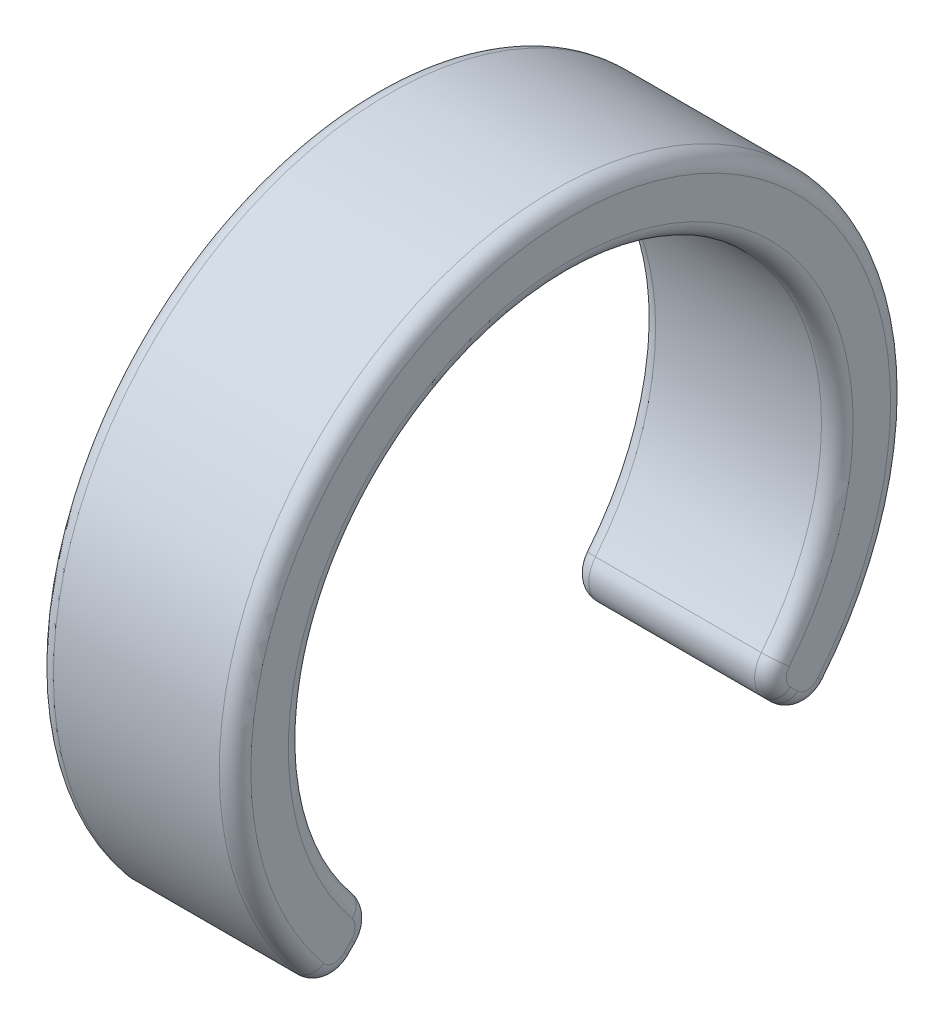
ISO-10303-21;
HEADER;
FILE_DESCRIPTION(('STEP AP214'),'2;1');
FILE_NAME('part.step','',(''),(''),'','','');
FILE_SCHEMA(('AUTOMOTIVE_DESIGN { 1 0 10303 214 1 1 1 1 }'));
ENDSEC;
DATA;
#1=APPLICATION_CONTEXT('core data for automotive mechanical design processes');
#2=APPLICATION_PROTOCOL_DEFINITION('international standard','automotive_design',2000,#1);
#3=PRODUCT_CONTEXT('',#1,'mechanical');
#4=PRODUCT('Part','Part','',(#3));
#5=PRODUCT_RELATED_PRODUCT_CATEGORY('part','',(#4));
#6=PRODUCT_DEFINITION_FORMATION('','',#4);
#7=PRODUCT_DEFINITION_CONTEXT('part definition',#1,'design');
#8=PRODUCT_DEFINITION('design','',#6,#7);
#9=PRODUCT_DEFINITION_SHAPE('','',#8);
#10=(LENGTH_UNIT() NAMED_UNIT(*) SI_UNIT(.MILLI.,.METRE.));
#11=(NAMED_UNIT(*) PLANE_ANGLE_UNIT() SI_UNIT($,.RADIAN.));
#12=(NAMED_UNIT(*) SI_UNIT($,.STERADIAN.) SOLID_ANGLE_UNIT());
#13=UNCERTAINTY_MEASURE_WITH_UNIT(LENGTH_MEASURE(1.E-05),#10,'distance_accuracy_value','');
#14=(GEOMETRIC_REPRESENTATION_CONTEXT(3) GLOBAL_UNCERTAINTY_ASSIGNED_CONTEXT((#13)) GLOBAL_UNIT_ASSIGNED_CONTEXT((#10,
#11,#12)) REPRESENTATION_CONTEXT('',''));
#15=CARTESIAN_POINT('',(0.,0.,0.));
#16=DIRECTION('',(0.,0.,1.));
#17=DIRECTION('',(1.,0.,0.));
#18=AXIS2_PLACEMENT_3D('',#15,#16,#17);
#19=CARTESIAN_POINT('',(5.,-12.0208152801714,12.0208152801712));
#20=DIRECTION('',(-1.,0.,0.));
#21=DIRECTION('',(0.,0.,1.));
#22=AXIS2_PLACEMENT_3D('',#19,#20,#21);
#23=PLANE('',#22);
#24=CARTESIAN_POINT('',(5.,0.,0.));
#25=DIRECTION('',(-1.,0.,0.));
#26=DIRECTION('',(0.,0.,1.));
#27=AXIS2_PLACEMENT_3D('',#24,#25,#26);
#28=CIRCLE('',#27,16.2);
#29=CARTESIAN_POINT('',(5.,-10.2928026757591,-12.5099245832213));
#30=VERTEX_POINT('',#29);
#31=CARTESIAN_POINT('',(5.,-10.2928026757591,12.5099245832213));
#32=VERTEX_POINT('',#31);
#33=EDGE_CURVE('E154',#30,#32,#28,.F.);
#34=ORIENTED_EDGE('',*,*,#33,.T.);
#35=CARTESIAN_POINT('',(5.,-9.84805194285595,11.9693722864155));
#36=DIRECTION('',(-1.,0.,0.));
#37=DIRECTION('',(0.,0.,1.));
#38=AXIS2_PLACEMENT_3D('',#35,#36,#37);
#39=CIRCLE('',#38,0.7);
#40=CARTESIAN_POINT('',(5.,-10.3430266896865,11.4743975395849));
#41=VERTEX_POINT('',#40);
#42=EDGE_CURVE('E191',#32,#41,#39,.F.);
#43=ORIENTED_EDGE('',*,*,#42,.T.);
#44=DIRECTION('',(0.,-0.707106781186551,0.707106781186544));
#45=VECTOR('',#44,1.);
#46=CARTESIAN_POINT('',(5.,-11.4551298552221,12.5865007051205));
#47=LINE('',#46,#45);
#48=CARTESIAN_POINT('',(5.,-9.98775003465354,11.1191208845519));
#49=VERTEX_POINT('',#48);
#50=EDGE_CURVE('E189',#41,#49,#47,.F.);
#51=ORIENTED_EDGE('',*,*,#50,.T.);
#52=CARTESIAN_POINT('',(5.,-9.49277528782295,11.6140956313825));
#53=DIRECTION('',(-1.,0.,0.));
#54=DIRECTION('',(0.,0.,1.));
#55=AXIS2_PLACEMENT_3D('',#52,#53,#54);
#56=CIRCLE('',#55,0.7);
#57=CARTESIAN_POINT('',(5.,-9.04977910772455,11.072104501918));
#58=VERTEX_POINT('',#57);
#59=EDGE_CURVE('E187',#49,#58,#56,.F.);
#60=ORIENTED_EDGE('',*,*,#59,.T.);
#61=CARTESIAN_POINT('',(5.,0.,0.));
#62=DIRECTION('',(-1.,0.,0.));
#63=DIRECTION('',(0.,0.,1.));
#64=AXIS2_PLACEMENT_3D('',#61,#62,#63);
#65=CIRCLE('',#64,14.3);
#66=CARTESIAN_POINT('',(5.,-9.04977910772455,-11.072104501918));
#67=VERTEX_POINT('',#66);
#68=EDGE_CURVE('E185',#58,#67,#65,.T.);
#69=ORIENTED_EDGE('',*,*,#68,.T.);
#70=CARTESIAN_POINT('',(5.,-9.49277528782295,-11.6140956313825));
#71=DIRECTION('',(-1.,0.,0.));
#72=DIRECTION('',(0.,0.,1.));
#73=AXIS2_PLACEMENT_3D('',#70,#71,#72);
#74=CIRCLE('',#73,0.7);
#75=CARTESIAN_POINT('',(5.,-9.98775003465354,-11.1191208845519));
#76=VERTEX_POINT('',#75);
#77=EDGE_CURVE('E183',#67,#76,#74,.F.);
#78=ORIENTED_EDGE('',*,*,#77,.T.);
#79=DIRECTION('',(0.,-0.707106781186551,-0.707106781186544));
#80=VECTOR('',#79,1.);
#81=CARTESIAN_POINT('',(5.,-10.3430266896865,-11.4743975395849));
#82=LINE('',#81,#80);
#83=CARTESIAN_POINT('',(5.,-10.3430266896865,-11.4743975395849));
#84=VERTEX_POINT('',#83);
#85=EDGE_CURVE('E157',#76,#84,#82,.T.);
#86=ORIENTED_EDGE('',*,*,#85,.T.);
#87=CARTESIAN_POINT('',(5.,-9.84805194285595,-11.9693722864155));
#88=DIRECTION('',(-1.,0.,0.));
#89=DIRECTION('',(0.,0.,1.));
#90=AXIS2_PLACEMENT_3D('',#87,#88,#89);
#91=CIRCLE('',#90,0.7);
#92=EDGE_CURVE('E150',#84,#30,#91,.F.);
#93=ORIENTED_EDGE('',*,*,#92,.T.);
#94=EDGE_LOOP('',(#34,#43,#51,#60,#69,#78,#86,#93));
#95=FACE_BOUND('',#94,.T.);
#96=ADVANCED_FACE('F35',(#95),#23,.F.);
#97=CARTESIAN_POINT('',(-29.230918038345,0.,0.));
#98=DIRECTION('',(-1.,0.,0.));
#99=DIRECTION('',(0.,0.,1.));
#100=AXIS2_PLACEMENT_3D('',#97,#98,#99);
#101=CYLINDRICAL_SURFACE('',#100,13.5);
#102=DIRECTION('',(-1.,0.,0.));
#103=VECTOR('',#102,1.);
#104=CARTESIAN_POINT('',(-29.230918038345,-8.54349775904066,-10.4526860682442));
#105=LINE('',#104,#103);
#106=CARTESIAN_POINT('',(-4.2,-8.54349775904066,-10.4526860682442));
#107=VERTEX_POINT('',#106);
#108=CARTESIAN_POINT('',(4.2,-8.54349775904066,-10.4526860682442));
#109=VERTEX_POINT('',#108);
#110=EDGE_CURVE('E306',#107,#109,#105,.F.);
#111=ORIENTED_EDGE('',*,*,#110,.T.);
#112=CARTESIAN_POINT('',(4.2,0.,0.));
#113=DIRECTION('',(-1.,0.,0.));
#114=DIRECTION('',(0.,0.,1.));
#115=AXIS2_PLACEMENT_3D('',#112,#113,#114);
#116=CIRCLE('',#115,13.5);
#117=CARTESIAN_POINT('',(4.2,-8.54349775904066,10.4526860682442));
#118=VERTEX_POINT('',#117);
#119=EDGE_CURVE('E209',#109,#118,#116,.F.);
#120=ORIENTED_EDGE('',*,*,#119,.T.);
#121=DIRECTION('',(-1.,0.,0.));
#122=VECTOR('',#121,1.);
#123=CARTESIAN_POINT('',(-29.230918038345,-8.54349775904066,10.4526860682442));
#124=LINE('',#123,#122);
#125=CARTESIAN_POINT('',(-4.2,-8.54349775904066,10.4526860682442));
#126=VERTEX_POINT('',#125);
#127=EDGE_CURVE('E303',#118,#126,#124,.T.);
#128=ORIENTED_EDGE('',*,*,#127,.T.);
#129=CARTESIAN_POINT('',(-4.2,0.,0.));
#130=DIRECTION('',(1.,0.,0.));
#131=DIRECTION('',(0.,0.,-1.));
#132=AXIS2_PLACEMENT_3D('',#129,#130,#131);
#133=CIRCLE('',#132,13.5);
#134=EDGE_CURVE('E207',#126,#107,#133,.F.);
#135=ORIENTED_EDGE('',*,*,#134,.T.);
#136=EDGE_LOOP('',(#111,#120,#128,#135));
#137=FACE_BOUND('',#136,.T.);
#138=ADVANCED_FACE('F337',(#137),#101,.F.);
#139=CARTESIAN_POINT('',(-5.,-12.0208152801714,12.0208152801712));
#140=DIRECTION('',(1.,0.,0.));
#141=DIRECTION('',(0.,0.,-1.));
#142=AXIS2_PLACEMENT_3D('',#139,#140,#141);
#143=PLANE('',#142);
#144=CARTESIAN_POINT('',(-5.,0.,0.));
#145=DIRECTION('',(1.,0.,0.));
#146=DIRECTION('',(0.,0.,-1.));
#147=AXIS2_PLACEMENT_3D('',#144,#145,#146);
#148=CIRCLE('',#147,14.3);
#149=CARTESIAN_POINT('',(-5.,-9.04977910772455,-11.072104501918));
#150=VERTEX_POINT('',#149);
#151=CARTESIAN_POINT('',(-5.,-9.04977910772455,11.072104501918));
#152=VERTEX_POINT('',#151);
#153=EDGE_CURVE('E222',#150,#152,#148,.T.);
#154=ORIENTED_EDGE('',*,*,#153,.T.);
#155=CARTESIAN_POINT('',(-5.,-9.49277528782295,11.6140956313825));
#156=DIRECTION('',(1.,0.,0.));
#157=DIRECTION('',(0.,0.,-1.));
#158=AXIS2_PLACEMENT_3D('',#155,#156,#157);
#159=CIRCLE('',#158,0.7);
#160=CARTESIAN_POINT('',(-5.,-9.98775003465354,11.1191208845519));
#161=VERTEX_POINT('',#160);
#162=EDGE_CURVE('E235',#152,#161,#159,.F.);
#163=ORIENTED_EDGE('',*,*,#162,.T.);
#164=DIRECTION('',(0.,0.707106781186551,-0.707106781186544));
#165=VECTOR('',#164,1.);
#166=CARTESIAN_POINT('',(-5.,-11.4551298552221,12.5865007051205));
#167=LINE('',#166,#165);
#168=CARTESIAN_POINT('',(-5.,-10.3430266896865,11.4743975395849));
#169=VERTEX_POINT('',#168);
#170=EDGE_CURVE('E59',#161,#169,#167,.F.);
#171=ORIENTED_EDGE('',*,*,#170,.T.);
#172=CARTESIAN_POINT('',(-5.,-9.84805194285595,11.9693722864155));
#173=DIRECTION('',(1.,0.,0.));
#174=DIRECTION('',(0.,0.,-1.));
#175=AXIS2_PLACEMENT_3D('',#172,#173,#174);
#176=CIRCLE('',#175,0.7);
#177=CARTESIAN_POINT('',(-5.,-10.2928026757591,12.5099245832213));
#178=VERTEX_POINT('',#177);
#179=EDGE_CURVE('E232',#169,#178,#176,.F.);
#180=ORIENTED_EDGE('',*,*,#179,.T.);
#181=CARTESIAN_POINT('',(-5.,0.,0.));
#182=DIRECTION('',(1.,0.,0.));
#183=DIRECTION('',(0.,0.,-1.));
#184=AXIS2_PLACEMENT_3D('',#181,#182,#183);
#185=CIRCLE('',#184,16.2);
#186=CARTESIAN_POINT('',(-5.,-10.2928026757591,-12.5099245832213));
#187=VERTEX_POINT('',#186);
#188=EDGE_CURVE('E230',#178,#187,#185,.F.);
#189=ORIENTED_EDGE('',*,*,#188,.T.);
#190=CARTESIAN_POINT('',(-5.,-9.84805194285595,-11.9693722864155));
#191=DIRECTION('',(1.,0.,0.));
#192=DIRECTION('',(0.,0.,-1.));
#193=AXIS2_PLACEMENT_3D('',#190,#191,#192);
#194=CIRCLE('',#193,0.7);
#195=CARTESIAN_POINT('',(-5.,-10.3430266896865,-11.4743975395849));
#196=VERTEX_POINT('',#195);
#197=EDGE_CURVE('E228',#187,#196,#194,.F.);
#198=ORIENTED_EDGE('',*,*,#197,.T.);
#199=DIRECTION('',(0.,0.707106781186551,0.707106781186544));
#200=VECTOR('',#199,1.);
#201=CARTESIAN_POINT('',(-5.,-9.98775003465354,-11.1191208845519));
#202=LINE('',#201,#200);
#203=CARTESIAN_POINT('',(-5.,-9.98775003465354,-11.1191208845519));
#204=VERTEX_POINT('',#203);
#205=EDGE_CURVE('E226',#196,#204,#202,.T.);
#206=ORIENTED_EDGE('',*,*,#205,.T.);
#207=CARTESIAN_POINT('',(-5.,-9.49277528782295,-11.6140956313825));
#208=DIRECTION('',(1.,0.,0.));
#209=DIRECTION('',(0.,0.,-1.));
#210=AXIS2_PLACEMENT_3D('',#207,#208,#209);
#211=CIRCLE('',#210,0.7);
#212=EDGE_CURVE('E224',#204,#150,#211,.F.);
#213=ORIENTED_EDGE('',*,*,#212,.T.);
#214=EDGE_LOOP('',(#154,#163,#171,#180,#189,#198,#206,#213));
#215=FACE_BOUND('',#214,.T.);
#216=ADVANCED_FACE('F323',(#215),#143,.F.);
#217=CARTESIAN_POINT('',(-29.230918038345,0.,0.));
#218=DIRECTION('',(-1.,0.,0.));
#219=DIRECTION('',(0.,0.,1.));
#220=AXIS2_PLACEMENT_3D('',#217,#218,#219);
#221=CYLINDRICAL_SURFACE('',#220,17.);
#222=DIRECTION('',(-1.,0.,0.));
#223=VECTOR('',#222,1.);
#224=CARTESIAN_POINT('',(-29.230918038345,-10.8010892276485,-13.1276986367138));
#225=LINE('',#224,#223);
#226=CARTESIAN_POINT('',(4.2,-10.8010892276485,-13.1276986367138));
#227=VERTEX_POINT('',#226);
#228=CARTESIAN_POINT('',(-4.2,-10.8010892276485,-13.1276986367138));
#229=VERTEX_POINT('',#228);
#230=EDGE_CURVE('E289',#227,#229,#225,.T.);
#231=ORIENTED_EDGE('',*,*,#230,.T.);
#232=CARTESIAN_POINT('',(-4.2,0.,0.));
#233=DIRECTION('',(1.,0.,0.));
#234=DIRECTION('',(0.,0.,-1.));
#235=AXIS2_PLACEMENT_3D('',#232,#233,#234);
#236=CIRCLE('',#235,17.);
#237=CARTESIAN_POINT('',(-4.2,-10.8010892276485,13.1276986367138));
#238=VERTEX_POINT('',#237);
#239=EDGE_CURVE('E11',#229,#238,#236,.T.);
#240=ORIENTED_EDGE('',*,*,#239,.T.);
#241=DIRECTION('',(-1.,0.,0.));
#242=VECTOR('',#241,1.);
#243=CARTESIAN_POINT('',(-29.230918038345,-10.8010892276485,13.1276986367138));
#244=LINE('',#243,#242);
#245=CARTESIAN_POINT('',(4.2,-10.8010892276485,13.1276986367138));
#246=VERTEX_POINT('',#245);
#247=EDGE_CURVE('E253',#238,#246,#244,.F.);
#248=ORIENTED_EDGE('',*,*,#247,.T.);
#249=CARTESIAN_POINT('',(4.2,0.,0.));
#250=DIRECTION('',(-1.,0.,0.));
#251=DIRECTION('',(0.,0.,1.));
#252=AXIS2_PLACEMENT_3D('',#249,#250,#251);
#253=CIRCLE('',#252,17.);
#254=EDGE_CURVE('E44',#246,#227,#253,.T.);
#255=ORIENTED_EDGE('',*,*,#254,.T.);
#256=EDGE_LOOP('',(#231,#240,#248,#255));
#257=FACE_BOUND('',#256,.T.);
#258=ADVANCED_FACE('F293',(#257),#221,.T.);
#259=CARTESIAN_POINT('',(0.,0.,0.));
#260=DIRECTION('',(0.,0.707106781186544,0.707106781186551));
#261=DIRECTION('',(-1.,0.,0.));
#262=AXIS2_PLACEMENT_3D('',#259,#260,#261);
#263=PLANE('',#262);
#264=DIRECTION('',(-1.,0.,0.));
#265=VECTOR('',#264,1.);
#266=CARTESIAN_POINT('',(0.,-10.5534354596028,10.5534354596027));
#267=LINE('',#266,#265);
#268=CARTESIAN_POINT('',(-4.2,-10.5534354596028,10.5534354596027));
#269=VERTEX_POINT('',#268);
#270=CARTESIAN_POINT('',(4.2,-10.5534354596028,10.5534354596027));
#271=VERTEX_POINT('',#270);
#272=EDGE_CURVE('E175',#269,#271,#267,.F.);
#273=ORIENTED_EDGE('',*,*,#272,.T.);
#274=DIRECTION('',(0.,-0.707106781186551,0.707106781186544));
#275=VECTOR('',#274,1.);
#276=CARTESIAN_POINT('',(4.2,0.,0.));
#277=LINE('',#276,#275);
#278=CARTESIAN_POINT('',(4.2,-10.9087121146358,10.9087121146357));
#279=VERTEX_POINT('',#278);
#280=EDGE_CURVE('E200',#271,#279,#277,.T.);
#281=ORIENTED_EDGE('',*,*,#280,.T.);
#282=DIRECTION('',(-1.,0.,0.));
#283=VECTOR('',#282,1.);
#284=CARTESIAN_POINT('',(0.,-10.9087121146358,10.9087121146357));
#285=LINE('',#284,#283);
#286=CARTESIAN_POINT('',(-4.2,-10.9087121146358,10.9087121146357));
#287=VERTEX_POINT('',#286);
#288=EDGE_CURVE('E178',#279,#287,#285,.T.);
#289=ORIENTED_EDGE('',*,*,#288,.T.);
#290=DIRECTION('',(0.,0.707106781186551,-0.707106781186544));
#291=VECTOR('',#290,1.);
#292=CARTESIAN_POINT('',(-4.2,0.,0.));
#293=LINE('',#292,#291);
#294=EDGE_CURVE('E198',#287,#269,#293,.T.);
#295=ORIENTED_EDGE('',*,*,#294,.T.);
#296=EDGE_LOOP('',(#273,#281,#289,#295));
#297=FACE_BOUND('',#296,.T.);
#298=ADVANCED_FACE('F312',(#297),#263,.F.);
#299=CARTESIAN_POINT('',(0.,0.,0.));
#300=DIRECTION('',(0.,-0.707106781186544,0.707106781186551));
#301=DIRECTION('',(-1.,0.,0.));
#302=AXIS2_PLACEMENT_3D('',#299,#300,#301);
#303=PLANE('',#302);
#304=DIRECTION('',(1.,0.,0.));
#305=VECTOR('',#304,1.);
#306=CARTESIAN_POINT('',(5.,-10.9087121146358,-10.9087121146357));
#307=LINE('',#306,#305);
#308=CARTESIAN_POINT('',(-4.2,-10.9087121146358,-10.9087121146357));
#309=VERTEX_POINT('',#308);
#310=CARTESIAN_POINT('',(4.2,-10.9087121146358,-10.9087121146357));
#311=VERTEX_POINT('',#310);
#312=EDGE_CURVE('E291',#309,#311,#307,.T.);
#313=ORIENTED_EDGE('',*,*,#312,.T.);
#314=DIRECTION('',(0.,-0.707106781186551,-0.707106781186544));
#315=VECTOR('',#314,1.);
#316=CARTESIAN_POINT('',(4.2,-10.5534354596028,-10.5534354596027));
#317=LINE('',#316,#315);
#318=CARTESIAN_POINT('',(4.2,-10.5534354596028,-10.5534354596027));
#319=VERTEX_POINT('',#318);
#320=EDGE_CURVE('E217',#311,#319,#317,.F.);
#321=ORIENTED_EDGE('',*,*,#320,.T.);
#322=DIRECTION('',(1.,0.,0.));
#323=VECTOR('',#322,1.);
#324=CARTESIAN_POINT('',(-4.99999999999999,-10.5534354596028,-10.5534354596027));
#325=LINE('',#324,#323);
#326=CARTESIAN_POINT('',(-4.2,-10.5534354596028,-10.5534354596027));
#327=VERTEX_POINT('',#326);
#328=EDGE_CURVE('E296',#319,#327,#325,.F.);
#329=ORIENTED_EDGE('',*,*,#328,.T.);
#330=DIRECTION('',(0.,0.707106781186551,0.707106781186544));
#331=VECTOR('',#330,1.);
#332=CARTESIAN_POINT('',(-4.2,-10.9087121146358,-10.9087121146357));
#333=LINE('',#332,#331);
#334=EDGE_CURVE('E215',#327,#309,#333,.F.);
#335=ORIENTED_EDGE('',*,*,#334,.T.);
#336=EDGE_LOOP('',(#313,#321,#329,#335));
#337=FACE_BOUND('',#336,.T.);
#338=ADVANCED_FACE('F366',(#337),#303,.T.);
#339=CARTESIAN_POINT('',(-29.230918038345,-9.84805194285595,-11.9693722864155));
#340=DIRECTION('',(-1.,0.,0.));
#341=DIRECTION('',(0.,0.,1.));
#342=AXIS2_PLACEMENT_3D('',#339,#340,#341);
#343=CYLINDRICAL_SURFACE('',#342,1.5);
#344=ORIENTED_EDGE('',*,*,#230,.F.);
#345=CARTESIAN_POINT('',(4.2,-9.84805194285595,-11.9693722864155));
#346=DIRECTION('',(-1.,0.,0.));
#347=DIRECTION('',(0.,0.,1.));
#348=AXIS2_PLACEMENT_3D('',#345,#346,#347);
#349=CIRCLE('',#348,1.5);
#350=EDGE_CURVE('E166',#227,#311,#349,.T.);
#351=ORIENTED_EDGE('',*,*,#350,.T.);
#352=ORIENTED_EDGE('',*,*,#312,.F.);
#353=CARTESIAN_POINT('',(-4.2,-9.84805194285595,-11.9693722864155));
#354=DIRECTION('',(1.,0.,0.));
#355=DIRECTION('',(0.,0.,-1.));
#356=AXIS2_PLACEMENT_3D('',#353,#354,#355);
#357=CIRCLE('',#356,1.5);
#358=EDGE_CURVE('E219',#309,#229,#357,.T.);
#359=ORIENTED_EDGE('',*,*,#358,.T.);
#360=EDGE_LOOP('',(#344,#351,#352,#359));
#361=FACE_BOUND('',#360,.T.);
#362=ADVANCED_FACE('F288',(#361),#343,.T.);
#363=CARTESIAN_POINT('',(-29.230918038345,-9.49277528782295,-11.6140956313825));
#364=DIRECTION('',(-1.,0.,0.));
#365=DIRECTION('',(0.,0.,1.));
#366=AXIS2_PLACEMENT_3D('',#363,#364,#365);
#367=CYLINDRICAL_SURFACE('',#366,1.5);
#368=ORIENTED_EDGE('',*,*,#328,.F.);
#369=CARTESIAN_POINT('',(4.2,-9.49277528782295,-11.6140956313825));
#370=DIRECTION('',(-1.,0.,0.));
#371=DIRECTION('',(0.,0.,1.));
#372=AXIS2_PLACEMENT_3D('',#369,#370,#371);
#373=CIRCLE('',#372,1.5);
#374=EDGE_CURVE('E213',#319,#109,#373,.T.);
#375=ORIENTED_EDGE('',*,*,#374,.T.);
#376=ORIENTED_EDGE('',*,*,#110,.F.);
#377=CARTESIAN_POINT('',(-4.2,-9.49277528782295,-11.6140956313825));
#378=DIRECTION('',(1.,0.,0.));
#379=DIRECTION('',(0.,0.,-1.));
#380=AXIS2_PLACEMENT_3D('',#377,#378,#379);
#381=CIRCLE('',#380,1.5);
#382=EDGE_CURVE('E211',#107,#327,#381,.T.);
#383=ORIENTED_EDGE('',*,*,#382,.T.);
#384=EDGE_LOOP('',(#368,#375,#376,#383));
#385=FACE_BOUND('',#384,.T.);
#386=ADVANCED_FACE('F363',(#385),#367,.T.);
#387=CARTESIAN_POINT('',(-29.230918038345,-9.49277528782295,11.6140956313825));
#388=DIRECTION('',(-1.,0.,0.));
#389=DIRECTION('',(0.,0.,1.));
#390=AXIS2_PLACEMENT_3D('',#387,#388,#389);
#391=CYLINDRICAL_SURFACE('',#390,1.5);
#392=ORIENTED_EDGE('',*,*,#127,.F.);
#393=CARTESIAN_POINT('',(4.2,-9.49277528782295,11.6140956313825));
#394=DIRECTION('',(-1.,0.,0.));
#395=DIRECTION('',(0.,0.,1.));
#396=AXIS2_PLACEMENT_3D('',#393,#394,#395);
#397=CIRCLE('',#396,1.5);
#398=EDGE_CURVE('E205',#118,#271,#397,.T.);
#399=ORIENTED_EDGE('',*,*,#398,.T.);
#400=ORIENTED_EDGE('',*,*,#272,.F.);
#401=CARTESIAN_POINT('',(-4.2,-9.49277528782295,11.6140956313825));
#402=DIRECTION('',(1.,0.,0.));
#403=DIRECTION('',(0.,0.,-1.));
#404=AXIS2_PLACEMENT_3D('',#401,#402,#403);
#405=CIRCLE('',#404,1.5);
#406=EDGE_CURVE('E202',#269,#126,#405,.T.);
#407=ORIENTED_EDGE('',*,*,#406,.T.);
#408=EDGE_LOOP('',(#392,#399,#400,#407));
#409=FACE_BOUND('',#408,.T.);
#410=ADVANCED_FACE('F335',(#409),#391,.T.);
#411=CARTESIAN_POINT('',(-29.230918038345,-9.84805194285595,11.9693722864155));
#412=DIRECTION('',(-1.,0.,0.));
#413=DIRECTION('',(0.,0.,1.));
#414=AXIS2_PLACEMENT_3D('',#411,#412,#413);
#415=CYLINDRICAL_SURFACE('',#414,1.5);
#416=ORIENTED_EDGE('',*,*,#288,.F.);
#417=CARTESIAN_POINT('',(4.2,-9.84805194285595,11.9693722864155));
#418=DIRECTION('',(-1.,0.,0.));
#419=DIRECTION('',(0.,0.,1.));
#420=AXIS2_PLACEMENT_3D('',#417,#418,#419);
#421=CIRCLE('',#420,1.5);
#422=EDGE_CURVE('E195',#279,#246,#421,.T.);
#423=ORIENTED_EDGE('',*,*,#422,.T.);
#424=ORIENTED_EDGE('',*,*,#247,.F.);
#425=CARTESIAN_POINT('',(-4.2,-9.84805194285595,11.9693722864155));
#426=DIRECTION('',(1.,0.,0.));
#427=DIRECTION('',(0.,0.,-1.));
#428=AXIS2_PLACEMENT_3D('',#425,#426,#427);
#429=CIRCLE('',#428,1.5);
#430=EDGE_CURVE('E193',#238,#287,#429,.T.);
#431=ORIENTED_EDGE('',*,*,#430,.T.);
#432=EDGE_LOOP('',(#416,#423,#424,#431));
#433=FACE_BOUND('',#432,.T.);
#434=ADVANCED_FACE('F354',(#433),#415,.T.);
#435=CARTESIAN_POINT('',(4.2,-9.49277528782295,-11.6140956313825));
#436=DIRECTION('',(-1.,0.,0.));
#437=DIRECTION('',(0.,0.,1.));
#438=AXIS2_PLACEMENT_3D('',#435,#436,#437);
#439=DEGENERATE_TOROIDAL_SURFACE('',#438,0.7,0.8,.T.);
#440=CARTESIAN_POINT('',(4.2,-9.04977910772455,-11.072104501918));
#441=DIRECTION('',(0.,0.774273042092165,-0.632851685854864));
#442=DIRECTION('',(0.,0.632851685854865,0.774273042092166));
#443=AXIS2_PLACEMENT_3D('',#440,#441,#442);
#444=CIRCLE('',#443,0.8);
#445=EDGE_CURVE('E247',#109,#67,#444,.T.);
#446=ORIENTED_EDGE('',*,*,#445,.F.);
#447=ORIENTED_EDGE('',*,*,#374,.F.);
#448=CARTESIAN_POINT('',(4.2,-9.98775003465354,-11.1191208845519));
#449=DIRECTION('',(0.,-0.707106781186551,-0.707106781186544));
#450=DIRECTION('',(0.,0.707106781186544,-0.707106781186551));
#451=AXIS2_PLACEMENT_3D('',#448,#449,#450);
#452=CIRCLE('',#451,0.8);
#453=EDGE_CURVE('E250',#76,#319,#452,.T.);
#454=ORIENTED_EDGE('',*,*,#453,.F.);
#455=ORIENTED_EDGE('',*,*,#77,.F.);
#456=EDGE_LOOP('',(#446,#447,#454,#455));
#457=FACE_BOUND('',#456,.T.);
#458=ADVANCED_FACE('F373',(#457),#439,.T.);
#459=CARTESIAN_POINT('',(4.2,0.565685424949107,-0.565685424949367));
#460=DIRECTION('',(0.,0.707106781186551,0.707106781186544));
#461=DIRECTION('',(0.,-0.707106781186544,0.707106781186551));
#462=AXIS2_PLACEMENT_3D('',#459,#460,#461);
#463=CYLINDRICAL_SURFACE('',#462,0.8);
#464=ORIENTED_EDGE('',*,*,#453,.T.);
#465=ORIENTED_EDGE('',*,*,#320,.F.);
#466=CARTESIAN_POINT('',(4.2,-10.3430266896865,-11.4743975395849));
#467=DIRECTION('',(0.,-0.707106781186551,-0.707106781186544));
#468=DIRECTION('',(0.,0.707106781186544,-0.707106781186551));
#469=AXIS2_PLACEMENT_3D('',#466,#467,#468);
#470=CIRCLE('',#469,0.8);
#471=EDGE_CURVE('E245',#84,#311,#470,.T.);
#472=ORIENTED_EDGE('',*,*,#471,.F.);
#473=ORIENTED_EDGE('',*,*,#85,.F.);
#474=EDGE_LOOP('',(#464,#465,#472,#473));
#475=FACE_BOUND('',#474,.T.);
#476=ADVANCED_FACE('F369',(#475),#463,.T.);
#477=CARTESIAN_POINT('',(4.2,0.,0.));
#478=DIRECTION('',(-1.,0.,0.));
#479=DIRECTION('',(0.,0.,1.));
#480=AXIS2_PLACEMENT_3D('',#477,#478,#479);
#481=TOROIDAL_SURFACE('',#480,14.3,0.8);
#482=ORIENTED_EDGE('',*,*,#445,.T.);
#483=ORIENTED_EDGE('',*,*,#68,.F.);
#484=CARTESIAN_POINT('',(4.2,-9.04977910772455,11.072104501918));
#485=DIRECTION('',(0.,-0.774273042092165,-0.632851685854864));
#486=DIRECTION('',(0.,0.632851685854865,-0.774273042092166));
#487=AXIS2_PLACEMENT_3D('',#484,#485,#486);
#488=CIRCLE('',#487,0.8);
#489=EDGE_CURVE('E169',#118,#58,#488,.T.);
#490=ORIENTED_EDGE('',*,*,#489,.F.);
#491=ORIENTED_EDGE('',*,*,#119,.F.);
#492=EDGE_LOOP('',(#482,#483,#490,#491));
#493=FACE_BOUND('',#492,.T.);
#494=ADVANCED_FACE('F341',(#493),#481,.T.);
#495=CARTESIAN_POINT('',(4.2,-9.84805194285595,-11.9693722864155));
#496=DIRECTION('',(-1.,0.,0.));
#497=DIRECTION('',(0.,0.,1.));
#498=AXIS2_PLACEMENT_3D('',#495,#496,#497);
#499=DEGENERATE_TOROIDAL_SURFACE('',#498,0.7,0.8,.T.);
#500=ORIENTED_EDGE('',*,*,#471,.T.);
#501=ORIENTED_EDGE('',*,*,#350,.F.);
#502=CARTESIAN_POINT('',(4.2,-10.2928026757591,-12.5099245832213));
#503=DIRECTION('',(0.,0.772217566865515,-0.635358189861675));
#504=DIRECTION('',(0.,0.635358189861675,0.772217566865515));
#505=AXIS2_PLACEMENT_3D('',#502,#503,#504);
#506=CIRCLE('',#505,0.8);
#507=EDGE_CURVE('E164',#30,#227,#506,.T.);
#508=ORIENTED_EDGE('',*,*,#507,.F.);
#509=ORIENTED_EDGE('',*,*,#92,.F.);
#510=EDGE_LOOP('',(#500,#501,#508,#509));
#511=FACE_BOUND('',#510,.T.);
#512=ADVANCED_FACE('F165',(#511),#499,.T.);
#513=CARTESIAN_POINT('',(4.2,-9.49277528782295,11.6140956313825));
#514=DIRECTION('',(-1.,0.,0.));
#515=DIRECTION('',(0.,0.,1.));
#516=AXIS2_PLACEMENT_3D('',#513,#514,#515);
#517=DEGENERATE_TOROIDAL_SURFACE('',#516,0.7,0.8,.T.);
#518=ORIENTED_EDGE('',*,*,#489,.T.);
#519=ORIENTED_EDGE('',*,*,#59,.F.);
#520=CARTESIAN_POINT('',(4.2,-9.98775003465354,11.1191208845519));
#521=DIRECTION('',(0.,-0.707106781186551,0.707106781186544));
#522=DIRECTION('',(0.,-0.707106781186544,-0.707106781186551));
#523=AXIS2_PLACEMENT_3D('',#520,#521,#522);
#524=CIRCLE('',#523,0.8);
#525=EDGE_CURVE('E170',#271,#49,#524,.T.);
#526=ORIENTED_EDGE('',*,*,#525,.F.);
#527=ORIENTED_EDGE('',*,*,#398,.F.);
#528=EDGE_LOOP('',(#518,#519,#526,#527));
#529=FACE_BOUND('',#528,.T.);
#530=ADVANCED_FACE('F347',(#529),#517,.T.);
#531=CARTESIAN_POINT('',(4.2,0.,0.));
#532=DIRECTION('',(-1.,0.,0.));
#533=DIRECTION('',(0.,0.,1.));
#534=AXIS2_PLACEMENT_3D('',#531,#532,#533);
#535=TOROIDAL_SURFACE('',#534,16.2,0.8);
#536=ORIENTED_EDGE('',*,*,#507,.T.);
#537=ORIENTED_EDGE('',*,*,#254,.F.);
#538=CARTESIAN_POINT('',(4.2,-10.2928026757591,12.5099245832213));
#539=DIRECTION('',(0.,-0.772217566865514,-0.635358189861676));
#540=DIRECTION('',(0.,0.635358189861676,-0.772217566865514));
#541=AXIS2_PLACEMENT_3D('',#538,#539,#540);
#542=CIRCLE('',#541,0.8);
#543=EDGE_CURVE('E173',#32,#246,#542,.T.);
#544=ORIENTED_EDGE('',*,*,#543,.F.);
#545=ORIENTED_EDGE('',*,*,#33,.F.);
#546=EDGE_LOOP('',(#536,#537,#544,#545));
#547=FACE_BOUND('',#546,.T.);
#548=ADVANCED_FACE('F172',(#547),#535,.T.);
#549=CARTESIAN_POINT('',(4.2,0.565685424949235,0.565685424949241));
#550=DIRECTION('',(0.,-0.707106781186551,0.707106781186544));
#551=DIRECTION('',(0.,-0.707106781186544,-0.707106781186551));
#552=AXIS2_PLACEMENT_3D('',#549,#550,#551);
#553=CYLINDRICAL_SURFACE('',#552,0.8);
#554=ORIENTED_EDGE('',*,*,#525,.T.);
#555=ORIENTED_EDGE('',*,*,#50,.F.);
#556=CARTESIAN_POINT('',(4.2,-10.3430266896865,11.4743975395849));
#557=DIRECTION('',(0.,-0.707106781186551,0.707106781186544));
#558=DIRECTION('',(0.,-0.707106781186544,-0.707106781186551));
#559=AXIS2_PLACEMENT_3D('',#556,#557,#558);
#560=CIRCLE('',#559,0.8);
#561=EDGE_CURVE('E238',#279,#41,#560,.T.);
#562=ORIENTED_EDGE('',*,*,#561,.F.);
#563=ORIENTED_EDGE('',*,*,#280,.F.);
#564=EDGE_LOOP('',(#554,#555,#562,#563));
#565=FACE_BOUND('',#564,.T.);
#566=ADVANCED_FACE('F351',(#565),#553,.T.);
#567=CARTESIAN_POINT('',(4.2,-9.84805194285595,11.9693722864155));
#568=DIRECTION('',(-1.,0.,0.));
#569=DIRECTION('',(0.,0.,1.));
#570=AXIS2_PLACEMENT_3D('',#567,#568,#569);
#571=DEGENERATE_TOROIDAL_SURFACE('',#570,0.7,0.8,.T.);
#572=ORIENTED_EDGE('',*,*,#543,.T.);
#573=ORIENTED_EDGE('',*,*,#422,.F.);
#574=ORIENTED_EDGE('',*,*,#561,.T.);
#575=ORIENTED_EDGE('',*,*,#42,.F.);
#576=EDGE_LOOP('',(#572,#573,#574,#575));
#577=FACE_BOUND('',#576,.T.);
#578=ADVANCED_FACE('F353',(#577),#571,.T.);
#579=CARTESIAN_POINT('',(-4.2,-9.84805194285595,-11.9693722864155));
#580=DIRECTION('',(1.,0.,0.));
#581=DIRECTION('',(0.,0.,-1.));
#582=AXIS2_PLACEMENT_3D('',#579,#580,#581);
#583=DEGENERATE_TOROIDAL_SURFACE('',#582,0.7,0.8,.T.);
#584=CARTESIAN_POINT('',(-4.2,-10.2928026757591,-12.5099245832213));
#585=DIRECTION('',(0.,0.772217566865515,-0.635358189861675));
#586=DIRECTION('',(0.,0.635358189861675,0.772217566865515));
#587=AXIS2_PLACEMENT_3D('',#584,#585,#586);
#588=CIRCLE('',#587,0.8);
#589=EDGE_CURVE('E268',#229,#187,#588,.T.);
#590=ORIENTED_EDGE('',*,*,#589,.F.);
#591=ORIENTED_EDGE('',*,*,#358,.F.);
#592=CARTESIAN_POINT('',(-4.2,-10.3430266896865,-11.4743975395849));
#593=DIRECTION('',(0.,0.707106781186551,0.707106781186544));
#594=DIRECTION('',(0.,-0.707106781186544,0.707106781186551));
#595=AXIS2_PLACEMENT_3D('',#592,#593,#594);
#596=CIRCLE('',#595,0.8);
#597=EDGE_CURVE('E39',#196,#309,#596,.T.);
#598=ORIENTED_EDGE('',*,*,#597,.F.);
#599=ORIENTED_EDGE('',*,*,#197,.F.);
#600=EDGE_LOOP('',(#590,#591,#598,#599));
#601=FACE_BOUND('',#600,.T.);
#602=ADVANCED_FACE('F37',(#601),#583,.T.);
#603=CARTESIAN_POINT('',(-4.2,0.565685424949107,-0.565685424949367));
#604=DIRECTION('',(0.,-0.707106781186551,-0.707106781186544));
#605=DIRECTION('',(0.,0.707106781186544,-0.707106781186551));
#606=AXIS2_PLACEMENT_3D('',#603,#604,#605);
#607=CYLINDRICAL_SURFACE('',#606,0.8);
#608=ORIENTED_EDGE('',*,*,#597,.T.);
#609=ORIENTED_EDGE('',*,*,#334,.F.);
#610=CARTESIAN_POINT('',(-4.2,-9.98775003465354,-11.1191208845519));
#611=DIRECTION('',(0.,0.707106781186551,0.707106781186544));
#612=DIRECTION('',(0.,-0.707106781186544,0.707106781186551));
#613=AXIS2_PLACEMENT_3D('',#610,#611,#612);
#614=CIRCLE('',#613,0.8);
#615=EDGE_CURVE('E266',#204,#327,#614,.T.);
#616=ORIENTED_EDGE('',*,*,#615,.F.);
#617=ORIENTED_EDGE('',*,*,#205,.F.);
#618=EDGE_LOOP('',(#608,#609,#616,#617));
#619=FACE_BOUND('',#618,.T.);
#620=ADVANCED_FACE('F279',(#619),#607,.T.);
#621=CARTESIAN_POINT('',(-4.2,0.,0.));
#622=DIRECTION('',(1.,0.,0.));
#623=DIRECTION('',(0.,0.,-1.));
#624=AXIS2_PLACEMENT_3D('',#621,#622,#623);
#625=TOROIDAL_SURFACE('',#624,16.2,0.8);
#626=ORIENTED_EDGE('',*,*,#589,.T.);
#627=ORIENTED_EDGE('',*,*,#188,.F.);
#628=CARTESIAN_POINT('',(-4.2,-10.2928026757591,12.5099245832213));
#629=DIRECTION('',(0.,-0.772217566865515,-0.635358189861675));
#630=DIRECTION('',(0.,0.635358189861675,-0.772217566865515));
#631=AXIS2_PLACEMENT_3D('',#628,#629,#630);
#632=CIRCLE('',#631,0.8);
#633=EDGE_CURVE('E263',#238,#178,#632,.T.);
#634=ORIENTED_EDGE('',*,*,#633,.F.);
#635=ORIENTED_EDGE('',*,*,#239,.F.);
#636=EDGE_LOOP('',(#626,#627,#634,#635));
#637=FACE_BOUND('',#636,.T.);
#638=ADVANCED_FACE('F356',(#637),#625,.T.);
#639=CARTESIAN_POINT('',(-4.2,-9.49277528782295,-11.6140956313825));
#640=DIRECTION('',(1.,0.,0.));
#641=DIRECTION('',(0.,0.,-1.));
#642=AXIS2_PLACEMENT_3D('',#639,#640,#641);
#643=DEGENERATE_TOROIDAL_SURFACE('',#642,0.7,0.8,.T.);
#644=ORIENTED_EDGE('',*,*,#615,.T.);
#645=ORIENTED_EDGE('',*,*,#382,.F.);
#646=CARTESIAN_POINT('',(-4.2,-9.04977910772455,-11.072104501918));
#647=DIRECTION('',(0.,0.774273042092165,-0.632851685854864));
#648=DIRECTION('',(0.,0.632851685854864,0.774273042092165));
#649=AXIS2_PLACEMENT_3D('',#646,#647,#648);
#650=CIRCLE('',#649,0.8);
#651=EDGE_CURVE('E260',#150,#107,#650,.T.);
#652=ORIENTED_EDGE('',*,*,#651,.F.);
#653=ORIENTED_EDGE('',*,*,#212,.F.);
#654=EDGE_LOOP('',(#644,#645,#652,#653));
#655=FACE_BOUND('',#654,.T.);
#656=ADVANCED_FACE('F360',(#655),#643,.T.);
#657=CARTESIAN_POINT('',(-4.2,-9.84805194285595,11.9693722864155));
#658=DIRECTION('',(1.,0.,0.));
#659=DIRECTION('',(0.,0.,-1.));
#660=AXIS2_PLACEMENT_3D('',#657,#658,#659);
#661=DEGENERATE_TOROIDAL_SURFACE('',#660,0.7,0.8,.T.);
#662=ORIENTED_EDGE('',*,*,#633,.T.);
#663=ORIENTED_EDGE('',*,*,#179,.F.);
#664=CARTESIAN_POINT('',(-4.2,-10.3430266896865,11.4743975395849));
#665=DIRECTION('',(0.,0.707106781186552,-0.707106781186543));
#666=DIRECTION('',(0.,0.707106781186543,0.707106781186552));
#667=AXIS2_PLACEMENT_3D('',#664,#665,#666);
#668=CIRCLE('',#667,0.8);
#669=EDGE_CURVE('E257',#287,#169,#668,.T.);
#670=ORIENTED_EDGE('',*,*,#669,.F.);
#671=ORIENTED_EDGE('',*,*,#430,.F.);
#672=EDGE_LOOP('',(#662,#663,#670,#671));
#673=FACE_BOUND('',#672,.T.);
#674=ADVANCED_FACE('F320',(#673),#661,.T.);
#675=CARTESIAN_POINT('',(-4.2,0.,0.));
#676=DIRECTION('',(1.,0.,0.));
#677=DIRECTION('',(0.,0.,-1.));
#678=AXIS2_PLACEMENT_3D('',#675,#676,#677);
#679=TOROIDAL_SURFACE('',#678,14.3,0.8);
#680=ORIENTED_EDGE('',*,*,#651,.T.);
#681=ORIENTED_EDGE('',*,*,#134,.F.);
#682=CARTESIAN_POINT('',(-4.2,-9.04977910772455,11.072104501918));
#683=DIRECTION('',(0.,-0.774273042092166,-0.632851685854864));
#684=DIRECTION('',(0.,0.632851685854864,-0.774273042092166));
#685=AXIS2_PLACEMENT_3D('',#682,#683,#684);
#686=CIRCLE('',#685,0.8);
#687=EDGE_CURVE('E255',#152,#126,#686,.T.);
#688=ORIENTED_EDGE('',*,*,#687,.F.);
#689=ORIENTED_EDGE('',*,*,#153,.F.);
#690=EDGE_LOOP('',(#680,#681,#688,#689));
#691=FACE_BOUND('',#690,.T.);
#692=ADVANCED_FACE('F329',(#691),#679,.T.);
#693=CARTESIAN_POINT('',(-4.2,0.565685424949235,0.565685424949241));
#694=DIRECTION('',(0.,0.707106781186551,-0.707106781186544));
#695=DIRECTION('',(0.,0.707106781186544,0.707106781186551));
#696=AXIS2_PLACEMENT_3D('',#693,#694,#695);
#697=CYLINDRICAL_SURFACE('',#696,0.8);
#698=ORIENTED_EDGE('',*,*,#669,.T.);
#699=ORIENTED_EDGE('',*,*,#170,.F.);
#700=CARTESIAN_POINT('',(-4.2,-9.98775003465354,11.1191208845519));
#701=DIRECTION('',(0.,0.707106781186551,-0.707106781186544));
#702=DIRECTION('',(0.,0.707106781186544,0.707106781186551));
#703=AXIS2_PLACEMENT_3D('',#700,#701,#702);
#704=CIRCLE('',#703,0.8);
#705=EDGE_CURVE('E52',#269,#161,#704,.T.);
#706=ORIENTED_EDGE('',*,*,#705,.F.);
#707=ORIENTED_EDGE('',*,*,#294,.F.);
#708=EDGE_LOOP('',(#698,#699,#706,#707));
#709=FACE_BOUND('',#708,.T.);
#710=ADVANCED_FACE('F322',(#709),#697,.T.);
#711=CARTESIAN_POINT('',(-4.2,-9.49277528782295,11.6140956313825));
#712=DIRECTION('',(1.,0.,0.));
#713=DIRECTION('',(0.,0.,-1.));
#714=AXIS2_PLACEMENT_3D('',#711,#712,#713);
#715=DEGENERATE_TOROIDAL_SURFACE('',#714,0.7,0.8,.T.);
#716=ORIENTED_EDGE('',*,*,#687,.T.);
#717=ORIENTED_EDGE('',*,*,#406,.F.);
#718=ORIENTED_EDGE('',*,*,#705,.T.);
#719=ORIENTED_EDGE('',*,*,#162,.F.);
#720=EDGE_LOOP('',(#716,#717,#718,#719));
#721=FACE_BOUND('',#720,.T.);
#722=ADVANCED_FACE('F326',(#721),#715,.T.);
#723=CLOSED_SHELL('',(#96,#138,#216,#258,#298,#338,#362,#386,#410,#434,#458,#476,#494,#512,#530,
#548,#566,#578,#602,#620,#638,#656,#674,#692,#710,#722));
#724=MANIFOLD_SOLID_BREP('B2',#723);
#725=ADVANCED_BREP_SHAPE_REPRESENTATION('',(#18,#724),#14);
#726=SHAPE_DEFINITION_REPRESENTATION(#9,#725);
ENDSEC;
END-ISO-10303-21;
